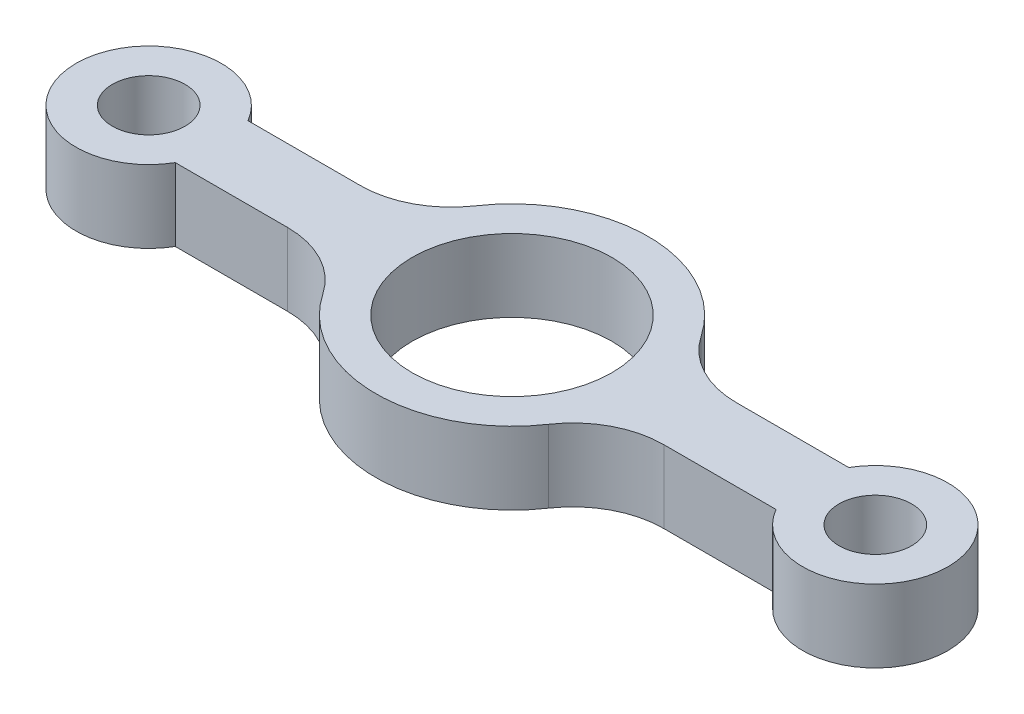
ISO-10303-21;
HEADER;
FILE_DESCRIPTION(('STEP AP214'),'2;1');
FILE_NAME('part.step','',(''),(''),'','','');
FILE_SCHEMA(('AUTOMOTIVE_DESIGN { 1 0 10303 214 1 1 1 1 }'));
ENDSEC;
DATA;
#1=APPLICATION_CONTEXT('core data for automotive mechanical design processes');
#2=APPLICATION_PROTOCOL_DEFINITION('international standard','automotive_design',2000,#1);
#3=PRODUCT_CONTEXT('',#1,'mechanical');
#4=PRODUCT('Part','Part','',(#3));
#5=PRODUCT_RELATED_PRODUCT_CATEGORY('part','',(#4));
#6=PRODUCT_DEFINITION_FORMATION('','',#4);
#7=PRODUCT_DEFINITION_CONTEXT('part definition',#1,'design');
#8=PRODUCT_DEFINITION('design','',#6,#7);
#9=PRODUCT_DEFINITION_SHAPE('','',#8);
#10=(LENGTH_UNIT() NAMED_UNIT(*) SI_UNIT(.MILLI.,.METRE.));
#11=(NAMED_UNIT(*) PLANE_ANGLE_UNIT() SI_UNIT($,.RADIAN.));
#12=(NAMED_UNIT(*) SI_UNIT($,.STERADIAN.) SOLID_ANGLE_UNIT());
#13=UNCERTAINTY_MEASURE_WITH_UNIT(LENGTH_MEASURE(1.E-05),#10,'distance_accuracy_value','');
#14=(GEOMETRIC_REPRESENTATION_CONTEXT(3) GLOBAL_UNCERTAINTY_ASSIGNED_CONTEXT((#13)) GLOBAL_UNIT_ASSIGNED_CONTEXT((#10,
#11,#12)) REPRESENTATION_CONTEXT('',''));
#15=CARTESIAN_POINT('',(0.,0.,0.));
#16=DIRECTION('',(0.,0.,1.));
#17=DIRECTION('',(1.,0.,0.));
#18=AXIS2_PLACEMENT_3D('',#15,#16,#17);
#19=CARTESIAN_POINT('',(-40.,8.,0.));
#20=DIRECTION('',(0.,1.,0.));
#21=DIRECTION('',(0.,0.,1.));
#22=AXIS2_PLACEMENT_3D('',#19,#20,#21);
#23=PLANE('',#22);
#24=CARTESIAN_POINT('',(-40.,8.,0.));
#25=DIRECTION('',(0.,1.,0.));
#26=DIRECTION('',(0.,0.,1.));
#27=AXIS2_PLACEMENT_3D('',#24,#25,#26);
#28=CIRCLE('',#27,4.);
#29=CARTESIAN_POINT('',(-40.,8.,4.));
#30=VERTEX_POINT('',#29);
#31=EDGE_CURVE('E286',#30,#30,#28,.T.);
#32=ORIENTED_EDGE('',*,*,#31,.F.);
#33=EDGE_LOOP('',(#32));
#34=FACE_BOUND('',#33,.T.);
#35=CARTESIAN_POINT('',(-40.,8.,0.));
#36=DIRECTION('',(0.,1.,0.));
#37=DIRECTION('',(0.,0.,1.));
#38=AXIS2_PLACEMENT_3D('',#35,#36,#37);
#39=CIRCLE('',#38,8.00000000000001);
#40=CARTESIAN_POINT('',(-33.0717967697245,8.,-3.99999999999998));
#41=VERTEX_POINT('',#40);
#42=CARTESIAN_POINT('',(-33.0717967697245,8.,4.));
#43=VERTEX_POINT('',#42);
#44=EDGE_CURVE('E177',#41,#43,#39,.T.);
#45=ORIENTED_EDGE('',*,*,#44,.T.);
#46=DIRECTION('',(1.,0.,0.));
#47=VECTOR('',#46,1.);
#48=CARTESIAN_POINT('',(-33.0717967697245,8.,4.));
#49=LINE('',#48,#47);
#50=CARTESIAN_POINT('',(-20.712315177208,8.,4.));
#51=VERTEX_POINT('',#50);
#52=EDGE_CURVE('E105',#43,#51,#49,.T.);
#53=ORIENTED_EDGE('',*,*,#52,.T.);
#54=CARTESIAN_POINT('',(-20.712315177208,8.,14.));
#55=DIRECTION('',(0.,-1.,0.));
#56=DIRECTION('',(0.,0.,1.));
#57=AXIS2_PLACEMENT_3D('',#54,#55,#56);
#58=CIRCLE('',#57,10.);
#59=CARTESIAN_POINT('',(-12.4273891063248,8.,8.39999999999999));
#60=VERTEX_POINT('',#59);
#61=EDGE_CURVE('E204',#51,#60,#58,.T.);
#62=ORIENTED_EDGE('',*,*,#61,.T.);
#63=CARTESIAN_POINT('',(0.,8.,0.));
#64=DIRECTION('',(0.,1.,0.));
#65=DIRECTION('',(0.,0.,1.));
#66=AXIS2_PLACEMENT_3D('',#63,#64,#65);
#67=CIRCLE('',#66,15.);
#68=CARTESIAN_POINT('',(12.4273891063248,8.,8.4));
#69=VERTEX_POINT('',#68);
#70=EDGE_CURVE('E223',#60,#69,#67,.T.);
#71=ORIENTED_EDGE('',*,*,#70,.T.);
#72=CARTESIAN_POINT('',(20.712315177208,8.,14.));
#73=DIRECTION('',(0.,-1.,0.));
#74=DIRECTION('',(0.,0.,1.));
#75=AXIS2_PLACEMENT_3D('',#72,#73,#74);
#76=CIRCLE('',#75,10.);
#77=CARTESIAN_POINT('',(20.712315177208,8.,3.99999999999999));
#78=VERTEX_POINT('',#77);
#79=EDGE_CURVE('E220',#69,#78,#76,.T.);
#80=ORIENTED_EDGE('',*,*,#79,.T.);
#81=DIRECTION('',(1.,0.,0.));
#82=VECTOR('',#81,1.);
#83=CARTESIAN_POINT('',(20.712315177208,8.,3.99999999999999));
#84=LINE('',#83,#82);
#85=CARTESIAN_POINT('',(33.0717967697245,8.,3.99999999999999));
#86=VERTEX_POINT('',#85);
#87=EDGE_CURVE('E222',#78,#86,#84,.T.);
#88=ORIENTED_EDGE('',*,*,#87,.T.);
#89=CARTESIAN_POINT('',(40.,8.,0.));
#90=DIRECTION('',(0.,1.,0.));
#91=DIRECTION('',(0.,0.,1.));
#92=AXIS2_PLACEMENT_3D('',#89,#90,#91);
#93=CIRCLE('',#92,8.00000000000001);
#94=CARTESIAN_POINT('',(33.0717967697245,8.,-3.99999999999999));
#95=VERTEX_POINT('',#94);
#96=EDGE_CURVE('E225',#86,#95,#93,.T.);
#97=ORIENTED_EDGE('',*,*,#96,.T.);
#98=DIRECTION('',(-1.,0.,0.));
#99=VECTOR('',#98,1.);
#100=CARTESIAN_POINT('',(20.712315177208,8.,-3.99999999999999));
#101=LINE('',#100,#99);
#102=CARTESIAN_POINT('',(20.712315177208,8.,-3.99999999999999));
#103=VERTEX_POINT('',#102);
#104=EDGE_CURVE('E231',#95,#103,#101,.T.);
#105=ORIENTED_EDGE('',*,*,#104,.T.);
#106=CARTESIAN_POINT('',(20.712315177208,8.,-14.));
#107=DIRECTION('',(0.,-1.,0.));
#108=DIRECTION('',(0.,0.,-1.));
#109=AXIS2_PLACEMENT_3D('',#106,#107,#108);
#110=CIRCLE('',#109,10.);
#111=CARTESIAN_POINT('',(12.4273891063248,8.,-8.4));
#112=VERTEX_POINT('',#111);
#113=EDGE_CURVE('E136',#103,#112,#110,.T.);
#114=ORIENTED_EDGE('',*,*,#113,.T.);
#115=CARTESIAN_POINT('',(0.,8.,0.));
#116=DIRECTION('',(0.,1.,0.));
#117=DIRECTION('',(0.,0.,1.));
#118=AXIS2_PLACEMENT_3D('',#115,#116,#117);
#119=CIRCLE('',#118,15.);
#120=CARTESIAN_POINT('',(-12.4273891063248,8.,-8.4));
#121=VERTEX_POINT('',#120);
#122=EDGE_CURVE('E130',#112,#121,#119,.T.);
#123=ORIENTED_EDGE('',*,*,#122,.T.);
#124=CARTESIAN_POINT('',(-20.712315177208,8.,-14.));
#125=DIRECTION('',(0.,-1.,0.));
#126=DIRECTION('',(0.,0.,-1.));
#127=AXIS2_PLACEMENT_3D('',#124,#125,#126);
#128=CIRCLE('',#127,10.);
#129=CARTESIAN_POINT('',(-20.712315177208,8.,-3.99999999999999));
#130=VERTEX_POINT('',#129);
#131=EDGE_CURVE('E134',#121,#130,#128,.T.);
#132=ORIENTED_EDGE('',*,*,#131,.T.);
#133=DIRECTION('',(-1.,0.,0.));
#134=VECTOR('',#133,1.);
#135=CARTESIAN_POINT('',(-33.0717967697245,8.,-3.99999999999998));
#136=LINE('',#135,#134);
#137=EDGE_CURVE('E50',#130,#41,#136,.T.);
#138=ORIENTED_EDGE('',*,*,#137,.T.);
#139=EDGE_LOOP('',(#45,#53,#62,#71,#80,#88,#97,#105,#114,#123,#132,#138));
#140=FACE_BOUND('',#139,.T.);
#141=CARTESIAN_POINT('',(40.,8.,0.));
#142=DIRECTION('',(0.,1.,0.));
#143=DIRECTION('',(0.,0.,1.));
#144=AXIS2_PLACEMENT_3D('',#141,#142,#143);
#145=CIRCLE('',#144,4.);
#146=CARTESIAN_POINT('',(40.,8.,4.));
#147=VERTEX_POINT('',#146);
#148=EDGE_CURVE('E158',#147,#147,#145,.T.);
#149=ORIENTED_EDGE('',*,*,#148,.F.);
#150=EDGE_LOOP('',(#149));
#151=FACE_BOUND('',#150,.T.);
#152=CARTESIAN_POINT('',(0.,8.,0.));
#153=DIRECTION('',(0.,1.,0.));
#154=DIRECTION('',(0.,0.,1.));
#155=AXIS2_PLACEMENT_3D('',#152,#153,#154);
#156=CIRCLE('',#155,11.);
#157=CARTESIAN_POINT('',(0.,8.,11.));
#158=VERTEX_POINT('',#157);
#159=EDGE_CURVE('E277',#158,#158,#156,.T.);
#160=ORIENTED_EDGE('',*,*,#159,.F.);
#161=EDGE_LOOP('',(#160));
#162=FACE_BOUND('',#161,.T.);
#163=ADVANCED_FACE('F33',(#34,#140,#151,#162),#23,.T.);
#164=CARTESIAN_POINT('',(-40.,0.,0.));
#165=DIRECTION('',(0.,1.,0.));
#166=DIRECTION('',(0.,0.,1.));
#167=AXIS2_PLACEMENT_3D('',#164,#165,#166);
#168=PLANE('',#167);
#169=CARTESIAN_POINT('',(-40.,0.,0.));
#170=DIRECTION('',(0.,1.,0.));
#171=DIRECTION('',(0.,0.,1.));
#172=AXIS2_PLACEMENT_3D('',#169,#170,#171);
#173=CIRCLE('',#172,8.00000000000001);
#174=CARTESIAN_POINT('',(-33.0717967697245,0.,-3.99999999999998));
#175=VERTEX_POINT('',#174);
#176=CARTESIAN_POINT('',(-33.0717967697245,0.,4.));
#177=VERTEX_POINT('',#176);
#178=EDGE_CURVE('E154',#175,#177,#173,.T.);
#179=ORIENTED_EDGE('',*,*,#178,.F.);
#180=DIRECTION('',(-1.,0.,0.));
#181=VECTOR('',#180,1.);
#182=CARTESIAN_POINT('',(-33.0717967697245,0.,-3.99999999999998));
#183=LINE('',#182,#181);
#184=CARTESIAN_POINT('',(-20.712315177208,0.,-3.99999999999999));
#185=VERTEX_POINT('',#184);
#186=EDGE_CURVE('E97',#185,#175,#183,.T.);
#187=ORIENTED_EDGE('',*,*,#186,.F.);
#188=CARTESIAN_POINT('',(-20.712315177208,0.,-14.));
#189=DIRECTION('',(0.,-1.,0.));
#190=DIRECTION('',(0.,0.,-1.));
#191=AXIS2_PLACEMENT_3D('',#188,#189,#190);
#192=CIRCLE('',#191,10.);
#193=CARTESIAN_POINT('',(-12.4273891063248,0.,-8.4));
#194=VERTEX_POINT('',#193);
#195=EDGE_CURVE('E91',#194,#185,#192,.T.);
#196=ORIENTED_EDGE('',*,*,#195,.F.);
#197=CARTESIAN_POINT('',(0.,0.,0.));
#198=DIRECTION('',(0.,1.,0.));
#199=DIRECTION('',(0.,0.,1.));
#200=AXIS2_PLACEMENT_3D('',#197,#198,#199);
#201=CIRCLE('',#200,15.);
#202=CARTESIAN_POINT('',(12.4273891063248,0.,-8.4));
#203=VERTEX_POINT('',#202);
#204=EDGE_CURVE('E144',#203,#194,#201,.T.);
#205=ORIENTED_EDGE('',*,*,#204,.F.);
#206=CARTESIAN_POINT('',(20.712315177208,0.,-14.));
#207=DIRECTION('',(0.,-1.,0.));
#208=DIRECTION('',(0.,0.,-1.));
#209=AXIS2_PLACEMENT_3D('',#206,#207,#208);
#210=CIRCLE('',#209,10.);
#211=CARTESIAN_POINT('',(20.712315177208,0.,-3.99999999999999));
#212=VERTEX_POINT('',#211);
#213=EDGE_CURVE('E172',#212,#203,#210,.T.);
#214=ORIENTED_EDGE('',*,*,#213,.F.);
#215=DIRECTION('',(-1.,0.,0.));
#216=VECTOR('',#215,1.);
#217=CARTESIAN_POINT('',(20.712315177208,0.,-3.99999999999999));
#218=LINE('',#217,#216);
#219=CARTESIAN_POINT('',(33.0717967697245,0.,-3.99999999999999));
#220=VERTEX_POINT('',#219);
#221=EDGE_CURVE('E170',#220,#212,#218,.T.);
#222=ORIENTED_EDGE('',*,*,#221,.F.);
#223=CARTESIAN_POINT('',(40.,0.,0.));
#224=DIRECTION('',(0.,1.,0.));
#225=DIRECTION('',(0.,0.,1.));
#226=AXIS2_PLACEMENT_3D('',#223,#224,#225);
#227=CIRCLE('',#226,8.00000000000001);
#228=CARTESIAN_POINT('',(33.0717967697245,0.,3.99999999999999));
#229=VERTEX_POINT('',#228);
#230=EDGE_CURVE('E168',#229,#220,#227,.T.);
#231=ORIENTED_EDGE('',*,*,#230,.F.);
#232=DIRECTION('',(1.,0.,0.));
#233=VECTOR('',#232,1.);
#234=CARTESIAN_POINT('',(20.712315177208,0.,3.99999999999999));
#235=LINE('',#234,#233);
#236=CARTESIAN_POINT('',(20.712315177208,0.,3.99999999999999));
#237=VERTEX_POINT('',#236);
#238=EDGE_CURVE('E166',#237,#229,#235,.T.);
#239=ORIENTED_EDGE('',*,*,#238,.F.);
#240=CARTESIAN_POINT('',(20.712315177208,0.,14.));
#241=DIRECTION('',(0.,-1.,0.));
#242=DIRECTION('',(0.,0.,1.));
#243=AXIS2_PLACEMENT_3D('',#240,#241,#242);
#244=CIRCLE('',#243,10.);
#245=CARTESIAN_POINT('',(12.4273891063248,0.,8.4));
#246=VERTEX_POINT('',#245);
#247=EDGE_CURVE('E164',#246,#237,#244,.T.);
#248=ORIENTED_EDGE('',*,*,#247,.F.);
#249=CARTESIAN_POINT('',(0.,0.,0.));
#250=DIRECTION('',(0.,1.,0.));
#251=DIRECTION('',(0.,0.,1.));
#252=AXIS2_PLACEMENT_3D('',#249,#250,#251);
#253=CIRCLE('',#252,15.);
#254=CARTESIAN_POINT('',(-12.4273891063248,0.,8.39999999999999));
#255=VERTEX_POINT('',#254);
#256=EDGE_CURVE('E162',#255,#246,#253,.T.);
#257=ORIENTED_EDGE('',*,*,#256,.F.);
#258=CARTESIAN_POINT('',(-20.712315177208,0.,14.));
#259=DIRECTION('',(0.,-1.,0.));
#260=DIRECTION('',(0.,0.,1.));
#261=AXIS2_PLACEMENT_3D('',#258,#259,#260);
#262=CIRCLE('',#261,10.);
#263=CARTESIAN_POINT('',(-20.712315177208,0.,4.));
#264=VERTEX_POINT('',#263);
#265=EDGE_CURVE('E160',#264,#255,#262,.T.);
#266=ORIENTED_EDGE('',*,*,#265,.F.);
#267=DIRECTION('',(1.,0.,0.));
#268=VECTOR('',#267,1.);
#269=CARTESIAN_POINT('',(-33.0717967697245,0.,4.));
#270=LINE('',#269,#268);
#271=EDGE_CURVE('E157',#177,#264,#270,.T.);
#272=ORIENTED_EDGE('',*,*,#271,.F.);
#273=EDGE_LOOP('',(#179,#187,#196,#205,#214,#222,#231,#239,#248,#257,#266,#272));
#274=FACE_BOUND('',#273,.T.);
#275=CARTESIAN_POINT('',(40.,0.,0.));
#276=DIRECTION('',(0.,1.,0.));
#277=DIRECTION('',(0.,0.,1.));
#278=AXIS2_PLACEMENT_3D('',#275,#276,#277);
#279=CIRCLE('',#278,4.);
#280=CARTESIAN_POINT('',(40.,0.,4.));
#281=VERTEX_POINT('',#280);
#282=EDGE_CURVE('E289',#281,#281,#279,.T.);
#283=ORIENTED_EDGE('',*,*,#282,.T.);
#284=EDGE_LOOP('',(#283));
#285=FACE_BOUND('',#284,.T.);
#286=CARTESIAN_POINT('',(-40.,0.,0.));
#287=DIRECTION('',(0.,1.,0.));
#288=DIRECTION('',(0.,0.,1.));
#289=AXIS2_PLACEMENT_3D('',#286,#287,#288);
#290=CIRCLE('',#289,4.);
#291=CARTESIAN_POINT('',(-40.,0.,4.));
#292=VERTEX_POINT('',#291);
#293=EDGE_CURVE('E283',#292,#292,#290,.T.);
#294=ORIENTED_EDGE('',*,*,#293,.T.);
#295=EDGE_LOOP('',(#294));
#296=FACE_BOUND('',#295,.T.);
#297=CARTESIAN_POINT('',(0.,0.,0.));
#298=DIRECTION('',(0.,1.,0.));
#299=DIRECTION('',(0.,0.,1.));
#300=AXIS2_PLACEMENT_3D('',#297,#298,#299);
#301=CIRCLE('',#300,11.);
#302=CARTESIAN_POINT('',(0.,0.,11.));
#303=VERTEX_POINT('',#302);
#304=EDGE_CURVE('E280',#303,#303,#301,.T.);
#305=ORIENTED_EDGE('',*,*,#304,.T.);
#306=EDGE_LOOP('',(#305));
#307=FACE_BOUND('',#306,.T.);
#308=ADVANCED_FACE('F208',(#274,#285,#296,#307),#168,.F.);
#309=CARTESIAN_POINT('',(-40.,8.,0.));
#310=DIRECTION('',(0.,-1.,0.));
#311=DIRECTION('',(0.,0.,-1.));
#312=AXIS2_PLACEMENT_3D('',#309,#310,#311);
#313=CYLINDRICAL_SURFACE('',#312,8.00000000000001);
#314=ORIENTED_EDGE('',*,*,#178,.T.);
#315=DIRECTION('',(0.,-1.,0.));
#316=VECTOR('',#315,1.);
#317=CARTESIAN_POINT('',(-33.0717967697245,8.,4.));
#318=LINE('',#317,#316);
#319=EDGE_CURVE('E11',#43,#177,#318,.T.);
#320=ORIENTED_EDGE('',*,*,#319,.F.);
#321=ORIENTED_EDGE('',*,*,#44,.F.);
#322=DIRECTION('',(0.,-1.,0.));
#323=VECTOR('',#322,1.);
#324=CARTESIAN_POINT('',(-33.0717967697245,8.,-3.99999999999998));
#325=LINE('',#324,#323);
#326=EDGE_CURVE('E150',#41,#175,#325,.T.);
#327=ORIENTED_EDGE('',*,*,#326,.T.);
#328=EDGE_LOOP('',(#314,#320,#321,#327));
#329=FACE_BOUND('',#328,.T.);
#330=ADVANCED_FACE('F35',(#329),#313,.T.);
#331=CARTESIAN_POINT('',(-33.0717967697245,8.,4.));
#332=DIRECTION('',(0.,0.,-1.));
#333=DIRECTION('',(-1.,0.,0.));
#334=AXIS2_PLACEMENT_3D('',#331,#332,#333);
#335=PLANE('',#334);
#336=ORIENTED_EDGE('',*,*,#271,.T.);
#337=DIRECTION('',(0.,-1.,0.));
#338=VECTOR('',#337,1.);
#339=CARTESIAN_POINT('',(-20.712315177208,8.,4.));
#340=LINE('',#339,#338);
#341=EDGE_CURVE('E42',#51,#264,#340,.T.);
#342=ORIENTED_EDGE('',*,*,#341,.F.);
#343=ORIENTED_EDGE('',*,*,#52,.F.);
#344=ORIENTED_EDGE('',*,*,#319,.T.);
#345=EDGE_LOOP('',(#336,#342,#343,#344));
#346=FACE_BOUND('',#345,.T.);
#347=ADVANCED_FACE('F391',(#346),#335,.F.);
#348=CARTESIAN_POINT('',(-20.712315177208,8.,14.));
#349=DIRECTION('',(0.,-1.,0.));
#350=DIRECTION('',(0.,0.,-1.));
#351=AXIS2_PLACEMENT_3D('',#348,#349,#350);
#352=CYLINDRICAL_SURFACE('',#351,10.);
#353=ORIENTED_EDGE('',*,*,#265,.T.);
#354=DIRECTION('',(0.,-1.,0.));
#355=VECTOR('',#354,1.);
#356=CARTESIAN_POINT('',(-12.4273891063248,8.,8.39999999999999));
#357=LINE('',#356,#355);
#358=EDGE_CURVE('E196',#60,#255,#357,.T.);
#359=ORIENTED_EDGE('',*,*,#358,.F.);
#360=ORIENTED_EDGE('',*,*,#61,.F.);
#361=ORIENTED_EDGE('',*,*,#341,.T.);
#362=EDGE_LOOP('',(#353,#359,#360,#361));
#363=FACE_BOUND('',#362,.T.);
#364=ADVANCED_FACE('F202',(#363),#352,.F.);
#365=CARTESIAN_POINT('',(0.,8.,0.));
#366=DIRECTION('',(0.,-1.,0.));
#367=DIRECTION('',(0.,0.,-1.));
#368=AXIS2_PLACEMENT_3D('',#365,#366,#367);
#369=CYLINDRICAL_SURFACE('',#368,15.);
#370=ORIENTED_EDGE('',*,*,#256,.T.);
#371=DIRECTION('',(0.,-1.,0.));
#372=VECTOR('',#371,1.);
#373=CARTESIAN_POINT('',(12.4273891063248,8.,8.4));
#374=LINE('',#373,#372);
#375=EDGE_CURVE('E193',#69,#246,#374,.T.);
#376=ORIENTED_EDGE('',*,*,#375,.F.);
#377=ORIENTED_EDGE('',*,*,#70,.F.);
#378=ORIENTED_EDGE('',*,*,#358,.T.);
#379=EDGE_LOOP('',(#370,#376,#377,#378));
#380=FACE_BOUND('',#379,.T.);
#381=ADVANCED_FACE('F214',(#380),#369,.T.);
#382=CARTESIAN_POINT('',(20.712315177208,8.,14.));
#383=DIRECTION('',(0.,-1.,0.));
#384=DIRECTION('',(0.,0.,-1.));
#385=AXIS2_PLACEMENT_3D('',#382,#383,#384);
#386=CYLINDRICAL_SURFACE('',#385,10.);
#387=ORIENTED_EDGE('',*,*,#247,.T.);
#388=DIRECTION('',(0.,-1.,0.));
#389=VECTOR('',#388,1.);
#390=CARTESIAN_POINT('',(20.712315177208,8.,3.99999999999999));
#391=LINE('',#390,#389);
#392=EDGE_CURVE('E190',#78,#237,#391,.T.);
#393=ORIENTED_EDGE('',*,*,#392,.F.);
#394=ORIENTED_EDGE('',*,*,#79,.F.);
#395=ORIENTED_EDGE('',*,*,#375,.T.);
#396=EDGE_LOOP('',(#387,#393,#394,#395));
#397=FACE_BOUND('',#396,.T.);
#398=ADVANCED_FACE('F218',(#397),#386,.F.);
#399=CARTESIAN_POINT('',(20.712315177208,8.,3.99999999999999));
#400=DIRECTION('',(0.,0.,-1.));
#401=DIRECTION('',(-1.,0.,0.));
#402=AXIS2_PLACEMENT_3D('',#399,#400,#401);
#403=PLANE('',#402);
#404=ORIENTED_EDGE('',*,*,#238,.T.);
#405=DIRECTION('',(0.,-1.,0.));
#406=VECTOR('',#405,1.);
#407=CARTESIAN_POINT('',(33.0717967697245,8.,3.99999999999999));
#408=LINE('',#407,#406);
#409=EDGE_CURVE('E187',#86,#229,#408,.T.);
#410=ORIENTED_EDGE('',*,*,#409,.F.);
#411=ORIENTED_EDGE('',*,*,#87,.F.);
#412=ORIENTED_EDGE('',*,*,#392,.T.);
#413=EDGE_LOOP('',(#404,#410,#411,#412));
#414=FACE_BOUND('',#413,.T.);
#415=ADVANCED_FACE('F356',(#414),#403,.F.);
#416=CARTESIAN_POINT('',(40.,8.,0.));
#417=DIRECTION('',(0.,-1.,0.));
#418=DIRECTION('',(0.,0.,-1.));
#419=AXIS2_PLACEMENT_3D('',#416,#417,#418);
#420=CYLINDRICAL_SURFACE('',#419,8.00000000000001);
#421=ORIENTED_EDGE('',*,*,#230,.T.);
#422=DIRECTION('',(0.,-1.,0.));
#423=VECTOR('',#422,1.);
#424=CARTESIAN_POINT('',(33.0717967697245,8.,-3.99999999999999));
#425=LINE('',#424,#423);
#426=EDGE_CURVE('E184',#95,#220,#425,.T.);
#427=ORIENTED_EDGE('',*,*,#426,.F.);
#428=ORIENTED_EDGE('',*,*,#96,.F.);
#429=ORIENTED_EDGE('',*,*,#409,.T.);
#430=EDGE_LOOP('',(#421,#427,#428,#429));
#431=FACE_BOUND('',#430,.T.);
#432=ADVANCED_FACE('F347',(#431),#420,.T.);
#433=CARTESIAN_POINT('',(20.712315177208,8.,-3.99999999999999));
#434=DIRECTION('',(0.,0.,1.));
#435=DIRECTION('',(1.,0.,0.));
#436=AXIS2_PLACEMENT_3D('',#433,#434,#435);
#437=PLANE('',#436);
#438=ORIENTED_EDGE('',*,*,#221,.T.);
#439=DIRECTION('',(0.,-1.,0.));
#440=VECTOR('',#439,1.);
#441=CARTESIAN_POINT('',(20.712315177208,8.,-3.99999999999999));
#442=LINE('',#441,#440);
#443=EDGE_CURVE('E181',#103,#212,#442,.T.);
#444=ORIENTED_EDGE('',*,*,#443,.F.);
#445=ORIENTED_EDGE('',*,*,#104,.F.);
#446=ORIENTED_EDGE('',*,*,#426,.T.);
#447=EDGE_LOOP('',(#438,#444,#445,#446));
#448=FACE_BOUND('',#447,.T.);
#449=ADVANCED_FACE('F237',(#448),#437,.F.);
#450=CARTESIAN_POINT('',(20.712315177208,8.,-14.));
#451=DIRECTION('',(0.,-1.,0.));
#452=DIRECTION('',(0.,0.,-1.));
#453=AXIS2_PLACEMENT_3D('',#450,#451,#452);
#454=CYLINDRICAL_SURFACE('',#453,10.);
#455=ORIENTED_EDGE('',*,*,#213,.T.);
#456=DIRECTION('',(0.,-1.,0.));
#457=VECTOR('',#456,1.);
#458=CARTESIAN_POINT('',(12.4273891063248,8.,-8.4));
#459=LINE('',#458,#457);
#460=EDGE_CURVE('E145',#112,#203,#459,.T.);
#461=ORIENTED_EDGE('',*,*,#460,.F.);
#462=ORIENTED_EDGE('',*,*,#113,.F.);
#463=ORIENTED_EDGE('',*,*,#443,.T.);
#464=EDGE_LOOP('',(#455,#461,#462,#463));
#465=FACE_BOUND('',#464,.T.);
#466=ADVANCED_FACE('F241',(#465),#454,.F.);
#467=CARTESIAN_POINT('',(0.,8.,0.));
#468=DIRECTION('',(0.,-1.,0.));
#469=DIRECTION('',(0.,0.,-1.));
#470=AXIS2_PLACEMENT_3D('',#467,#468,#469);
#471=CYLINDRICAL_SURFACE('',#470,15.);
#472=ORIENTED_EDGE('',*,*,#204,.T.);
#473=DIRECTION('',(0.,-1.,0.));
#474=VECTOR('',#473,1.);
#475=CARTESIAN_POINT('',(-12.4273891063248,8.,-8.4));
#476=LINE('',#475,#474);
#477=EDGE_CURVE('E141',#121,#194,#476,.T.);
#478=ORIENTED_EDGE('',*,*,#477,.F.);
#479=ORIENTED_EDGE('',*,*,#122,.F.);
#480=ORIENTED_EDGE('',*,*,#460,.T.);
#481=EDGE_LOOP('',(#472,#478,#479,#480));
#482=FACE_BOUND('',#481,.T.);
#483=ADVANCED_FACE('F142',(#482),#471,.T.);
#484=CARTESIAN_POINT('',(-20.712315177208,8.,-14.));
#485=DIRECTION('',(0.,-1.,0.));
#486=DIRECTION('',(0.,0.,-1.));
#487=AXIS2_PLACEMENT_3D('',#484,#485,#486);
#488=CYLINDRICAL_SURFACE('',#487,10.);
#489=ORIENTED_EDGE('',*,*,#195,.T.);
#490=DIRECTION('',(0.,-1.,0.));
#491=VECTOR('',#490,1.);
#492=CARTESIAN_POINT('',(-20.712315177208,8.,-3.99999999999999));
#493=LINE('',#492,#491);
#494=EDGE_CURVE('E146',#130,#185,#493,.T.);
#495=ORIENTED_EDGE('',*,*,#494,.F.);
#496=ORIENTED_EDGE('',*,*,#131,.F.);
#497=ORIENTED_EDGE('',*,*,#477,.T.);
#498=EDGE_LOOP('',(#489,#495,#496,#497));
#499=FACE_BOUND('',#498,.T.);
#500=ADVANCED_FACE('F148',(#499),#488,.F.);
#501=CARTESIAN_POINT('',(-33.0717967697245,8.,-3.99999999999998));
#502=DIRECTION('',(0.,0.,1.));
#503=DIRECTION('',(1.,0.,0.));
#504=AXIS2_PLACEMENT_3D('',#501,#502,#503);
#505=PLANE('',#504);
#506=ORIENTED_EDGE('',*,*,#186,.T.);
#507=ORIENTED_EDGE('',*,*,#326,.F.);
#508=ORIENTED_EDGE('',*,*,#137,.F.);
#509=ORIENTED_EDGE('',*,*,#494,.T.);
#510=EDGE_LOOP('',(#506,#507,#508,#509));
#511=FACE_BOUND('',#510,.T.);
#512=ADVANCED_FACE('F245',(#511),#505,.F.);
#513=CARTESIAN_POINT('',(40.,8.,0.));
#514=DIRECTION('',(0.,-1.,0.));
#515=DIRECTION('',(0.,0.,-1.));
#516=AXIS2_PLACEMENT_3D('',#513,#514,#515);
#517=CYLINDRICAL_SURFACE('',#516,4.);
#518=ORIENTED_EDGE('',*,*,#148,.T.);
#519=EDGE_LOOP('',(#518));
#520=FACE_BOUND('',#519,.T.);
#521=ORIENTED_EDGE('',*,*,#282,.F.);
#522=EDGE_LOOP('',(#521));
#523=FACE_BOUND('',#522,.T.);
#524=ADVANCED_FACE('F247',(#520,#523),#517,.F.);
#525=CARTESIAN_POINT('',(-40.,8.,0.));
#526=DIRECTION('',(0.,-1.,0.));
#527=DIRECTION('',(0.,0.,-1.));
#528=AXIS2_PLACEMENT_3D('',#525,#526,#527);
#529=CYLINDRICAL_SURFACE('',#528,4.);
#530=ORIENTED_EDGE('',*,*,#31,.T.);
#531=EDGE_LOOP('',(#530));
#532=FACE_BOUND('',#531,.T.);
#533=ORIENTED_EDGE('',*,*,#293,.F.);
#534=EDGE_LOOP('',(#533));
#535=FACE_BOUND('',#534,.T.);
#536=ADVANCED_FACE('F253',(#532,#535),#529,.F.);
#537=CARTESIAN_POINT('',(0.,8.,0.));
#538=DIRECTION('',(0.,-1.,0.));
#539=DIRECTION('',(0.,0.,-1.));
#540=AXIS2_PLACEMENT_3D('',#537,#538,#539);
#541=CYLINDRICAL_SURFACE('',#540,11.);
#542=ORIENTED_EDGE('',*,*,#159,.T.);
#543=EDGE_LOOP('',(#542));
#544=FACE_BOUND('',#543,.T.);
#545=ORIENTED_EDGE('',*,*,#304,.F.);
#546=EDGE_LOOP('',(#545));
#547=FACE_BOUND('',#546,.T.);
#548=ADVANCED_FACE('F268',(#544,#547),#541,.F.);
#549=CLOSED_SHELL('',(#163,#308,#330,#347,#364,#381,#398,#415,#432,#449,#466,#483,#500,#512,
#524,#536,#548));
#550=MANIFOLD_SOLID_BREP('B2',#549);
#551=ADVANCED_BREP_SHAPE_REPRESENTATION('',(#18,#550),#14);
#552=SHAPE_DEFINITION_REPRESENTATION(#9,#551);
ENDSEC;
END-ISO-10303-21;
